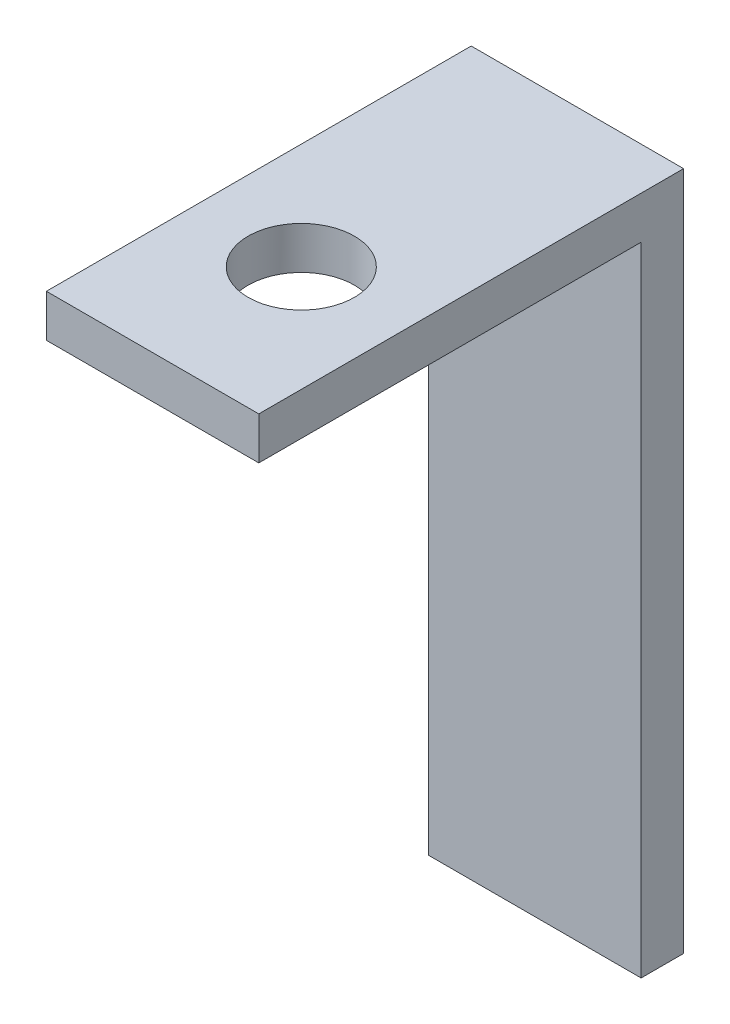
ISO-10303-21;
HEADER;
FILE_DESCRIPTION(('STEP AP214'),'2;1');
FILE_NAME('part.step','',(''),(''),'','','');
FILE_SCHEMA(('AUTOMOTIVE_DESIGN { 1 0 10303 214 1 1 1 1 }'));
ENDSEC;
DATA;
#1=APPLICATION_CONTEXT('core data for automotive mechanical design processes');
#2=APPLICATION_PROTOCOL_DEFINITION('international standard','automotive_design',2000,#1);
#3=PRODUCT_CONTEXT('',#1,'mechanical');
#4=PRODUCT('Part','Part','',(#3));
#5=PRODUCT_RELATED_PRODUCT_CATEGORY('part','',(#4));
#6=PRODUCT_DEFINITION_FORMATION('','',#4);
#7=PRODUCT_DEFINITION_CONTEXT('part definition',#1,'design');
#8=PRODUCT_DEFINITION('design','',#6,#7);
#9=PRODUCT_DEFINITION_SHAPE('','',#8);
#10=(LENGTH_UNIT() NAMED_UNIT(*) SI_UNIT(.MILLI.,.METRE.));
#11=(NAMED_UNIT(*) PLANE_ANGLE_UNIT() SI_UNIT($,.RADIAN.));
#12=(NAMED_UNIT(*) SI_UNIT($,.STERADIAN.) SOLID_ANGLE_UNIT());
#13=UNCERTAINTY_MEASURE_WITH_UNIT(LENGTH_MEASURE(1.E-05),#10,'distance_accuracy_value','');
#14=(GEOMETRIC_REPRESENTATION_CONTEXT(3) GLOBAL_UNCERTAINTY_ASSIGNED_CONTEXT((#13)) GLOBAL_UNIT_ASSIGNED_CONTEXT((#10,
#11,#12)) REPRESENTATION_CONTEXT('',''));
#15=CARTESIAN_POINT('',(0.,0.,0.));
#16=DIRECTION('',(0.,0.,1.));
#17=DIRECTION('',(1.,0.,0.));
#18=AXIS2_PLACEMENT_3D('',#15,#16,#17);
#19=CARTESIAN_POINT('',(5.,16.,2.));
#20=DIRECTION('',(-1.,0.,0.));
#21=DIRECTION('',(0.,-1.,0.));
#22=AXIS2_PLACEMENT_3D('',#19,#20,#21);
#23=PLANE('',#22);
#24=DIRECTION('',(0.,1.,0.));
#25=VECTOR('',#24,1.);
#26=CARTESIAN_POINT('',(5.,16.,0.));
#27=LINE('',#26,#25);
#28=CARTESIAN_POINT('',(5.,-16.,0.));
#29=VERTEX_POINT('',#28);
#30=CARTESIAN_POINT('',(5.,16.,0.));
#31=VERTEX_POINT('',#30);
#32=EDGE_CURVE('E92',#29,#31,#27,.T.);
#33=ORIENTED_EDGE('',*,*,#32,.T.);
#34=DIRECTION('',(0.,0.,-1.));
#35=VECTOR('',#34,1.);
#36=CARTESIAN_POINT('',(5.,16.,2.));
#37=LINE('',#36,#35);
#38=CARTESIAN_POINT('',(5.,16.,20.));
#39=VERTEX_POINT('',#38);
#40=EDGE_CURVE('E11',#39,#31,#37,.T.);
#41=ORIENTED_EDGE('',*,*,#40,.F.);
#42=DIRECTION('',(0.,1.,0.));
#43=VECTOR('',#42,1.);
#44=CARTESIAN_POINT('',(5.,16.,20.));
#45=LINE('',#44,#43);
#46=CARTESIAN_POINT('',(5.,14.,20.));
#47=VERTEX_POINT('',#46);
#48=EDGE_CURVE('E121',#47,#39,#45,.T.);
#49=ORIENTED_EDGE('',*,*,#48,.F.);
#50=DIRECTION('',(0.,0.,-1.));
#51=VECTOR('',#50,1.);
#52=CARTESIAN_POINT('',(5.,14.,20.));
#53=LINE('',#52,#51);
#54=CARTESIAN_POINT('',(5.,14.,2.));
#55=VERTEX_POINT('',#54);
#56=EDGE_CURVE('E101',#47,#55,#53,.T.);
#57=ORIENTED_EDGE('',*,*,#56,.T.);
#58=DIRECTION('',(0.,1.,0.));
#59=VECTOR('',#58,1.);
#60=CARTESIAN_POINT('',(5.,16.,2.));
#61=LINE('',#60,#59);
#62=CARTESIAN_POINT('',(5.,-16.,2.));
#63=VERTEX_POINT('',#62);
#64=EDGE_CURVE('E86',#63,#55,#61,.T.);
#65=ORIENTED_EDGE('',*,*,#64,.F.);
#66=DIRECTION('',(0.,0.,-1.));
#67=VECTOR('',#66,1.);
#68=CARTESIAN_POINT('',(5.,-16.,2.));
#69=LINE('',#68,#67);
#70=EDGE_CURVE('E79',#63,#29,#69,.T.);
#71=ORIENTED_EDGE('',*,*,#70,.T.);
#72=EDGE_LOOP('',(#33,#41,#49,#57,#65,#71));
#73=FACE_BOUND('',#72,.T.);
#74=ADVANCED_FACE('F35',(#73),#23,.F.);
#75=CARTESIAN_POINT('',(-5.,16.,2.));
#76=DIRECTION('',(0.,-1.,0.));
#77=DIRECTION('',(0.,0.,-1.));
#78=AXIS2_PLACEMENT_3D('',#75,#76,#77);
#79=PLANE('',#78);
#80=CARTESIAN_POINT('',(0.,16.,13.));
#81=DIRECTION('',(0.,1.,0.));
#82=DIRECTION('',(0.,0.,1.));
#83=AXIS2_PLACEMENT_3D('',#80,#81,#82);
#84=CIRCLE('',#83,2.5);
#85=CARTESIAN_POINT('',(0.,16.,15.5));
#86=VERTEX_POINT('',#85);
#87=EDGE_CURVE('E144',#86,#86,#84,.T.);
#88=ORIENTED_EDGE('',*,*,#87,.F.);
#89=EDGE_LOOP('',(#88));
#90=FACE_BOUND('',#89,.T.);
#91=DIRECTION('',(-1.,0.,0.));
#92=VECTOR('',#91,1.);
#93=CARTESIAN_POINT('',(-5.,16.,0.));
#94=LINE('',#93,#92);
#95=CARTESIAN_POINT('',(-5.,16.,0.));
#96=VERTEX_POINT('',#95);
#97=EDGE_CURVE('E96',#31,#96,#94,.T.);
#98=ORIENTED_EDGE('',*,*,#97,.T.);
#99=DIRECTION('',(0.,0.,-1.));
#100=VECTOR('',#99,1.);
#101=CARTESIAN_POINT('',(-5.,16.,2.));
#102=LINE('',#101,#100);
#103=CARTESIAN_POINT('',(-5.,16.,20.));
#104=VERTEX_POINT('',#103);
#105=EDGE_CURVE('E43',#104,#96,#102,.T.);
#106=ORIENTED_EDGE('',*,*,#105,.F.);
#107=DIRECTION('',(-1.,0.,0.));
#108=VECTOR('',#107,1.);
#109=CARTESIAN_POINT('',(-5.,16.,20.));
#110=LINE('',#109,#108);
#111=EDGE_CURVE('E134',#39,#104,#110,.T.);
#112=ORIENTED_EDGE('',*,*,#111,.F.);
#113=ORIENTED_EDGE('',*,*,#40,.T.);
#114=EDGE_LOOP('',(#98,#106,#112,#113));
#115=FACE_BOUND('',#114,.T.);
#116=ADVANCED_FACE('F150',(#90,#115),#79,.F.);
#117=CARTESIAN_POINT('',(-5.,16.,2.));
#118=DIRECTION('',(1.,0.,0.));
#119=DIRECTION('',(0.,1.,0.));
#120=AXIS2_PLACEMENT_3D('',#117,#118,#119);
#121=PLANE('',#120);
#122=DIRECTION('',(0.,-1.,0.));
#123=VECTOR('',#122,1.);
#124=CARTESIAN_POINT('',(-5.,16.,0.));
#125=LINE('',#124,#123);
#126=CARTESIAN_POINT('',(-5.,-16.,0.));
#127=VERTEX_POINT('',#126);
#128=EDGE_CURVE('E87',#96,#127,#125,.T.);
#129=ORIENTED_EDGE('',*,*,#128,.T.);
#130=DIRECTION('',(0.,0.,-1.));
#131=VECTOR('',#130,1.);
#132=CARTESIAN_POINT('',(-5.,-16.,2.));
#133=LINE('',#132,#131);
#134=CARTESIAN_POINT('',(-5.,-16.,2.));
#135=VERTEX_POINT('',#134);
#136=EDGE_CURVE('E82',#135,#127,#133,.T.);
#137=ORIENTED_EDGE('',*,*,#136,.F.);
#138=DIRECTION('',(0.,-1.,0.));
#139=VECTOR('',#138,1.);
#140=CARTESIAN_POINT('',(-5.,16.,2.));
#141=LINE('',#140,#139);
#142=CARTESIAN_POINT('',(-5.,14.,2.));
#143=VERTEX_POINT('',#142);
#144=EDGE_CURVE('E111',#143,#135,#141,.T.);
#145=ORIENTED_EDGE('',*,*,#144,.F.);
#146=DIRECTION('',(0.,0.,-1.));
#147=VECTOR('',#146,1.);
#148=CARTESIAN_POINT('',(-5.,14.,20.));
#149=LINE('',#148,#147);
#150=CARTESIAN_POINT('',(-5.,14.,20.));
#151=VERTEX_POINT('',#150);
#152=EDGE_CURVE('E97',#151,#143,#149,.T.);
#153=ORIENTED_EDGE('',*,*,#152,.F.);
#154=DIRECTION('',(0.,-1.,0.));
#155=VECTOR('',#154,1.);
#156=CARTESIAN_POINT('',(-5.,16.,20.));
#157=LINE('',#156,#155);
#158=EDGE_CURVE('E129',#104,#151,#157,.T.);
#159=ORIENTED_EDGE('',*,*,#158,.F.);
#160=ORIENTED_EDGE('',*,*,#105,.T.);
#161=EDGE_LOOP('',(#129,#137,#145,#153,#159,#160));
#162=FACE_BOUND('',#161,.T.);
#163=ADVANCED_FACE('F153',(#162),#121,.F.);
#164=CARTESIAN_POINT('',(-5.,-16.,2.));
#165=DIRECTION('',(0.,1.,0.));
#166=DIRECTION('',(0.,0.,1.));
#167=AXIS2_PLACEMENT_3D('',#164,#165,#166);
#168=PLANE('',#167);
#169=DIRECTION('',(1.,0.,0.));
#170=VECTOR('',#169,1.);
#171=CARTESIAN_POINT('',(-5.,-16.,0.));
#172=LINE('',#171,#170);
#173=EDGE_CURVE('E76',#127,#29,#172,.T.);
#174=ORIENTED_EDGE('',*,*,#173,.T.);
#175=ORIENTED_EDGE('',*,*,#70,.F.);
#176=DIRECTION('',(1.,0.,0.));
#177=VECTOR('',#176,1.);
#178=CARTESIAN_POINT('',(-5.,-16.,2.));
#179=LINE('',#178,#177);
#180=EDGE_CURVE('E57',#135,#63,#179,.T.);
#181=ORIENTED_EDGE('',*,*,#180,.F.);
#182=ORIENTED_EDGE('',*,*,#136,.T.);
#183=EDGE_LOOP('',(#174,#175,#181,#182));
#184=FACE_BOUND('',#183,.T.);
#185=ADVANCED_FACE('F78',(#184),#168,.F.);
#186=CARTESIAN_POINT('',(0.,0.,2.));
#187=DIRECTION('',(0.,0.,1.));
#188=DIRECTION('',(1.,0.,0.));
#189=AXIS2_PLACEMENT_3D('',#186,#187,#188);
#190=PLANE('',#189);
#191=DIRECTION('',(1.,0.,0.));
#192=VECTOR('',#191,1.);
#193=CARTESIAN_POINT('',(-5.,14.,2.));
#194=LINE('',#193,#192);
#195=EDGE_CURVE('E51',#143,#55,#194,.T.);
#196=ORIENTED_EDGE('',*,*,#195,.F.);
#197=ORIENTED_EDGE('',*,*,#144,.T.);
#198=ORIENTED_EDGE('',*,*,#180,.T.);
#199=ORIENTED_EDGE('',*,*,#64,.T.);
#200=EDGE_LOOP('',(#196,#197,#198,#199));
#201=FACE_BOUND('',#200,.T.);
#202=ADVANCED_FACE('F163',(#201),#190,.T.);
#203=CARTESIAN_POINT('',(0.,0.,0.));
#204=DIRECTION('',(0.,0.,1.));
#205=DIRECTION('',(1.,0.,0.));
#206=AXIS2_PLACEMENT_3D('',#203,#204,#205);
#207=PLANE('',#206);
#208=ORIENTED_EDGE('',*,*,#32,.F.);
#209=ORIENTED_EDGE('',*,*,#173,.F.);
#210=ORIENTED_EDGE('',*,*,#128,.F.);
#211=ORIENTED_EDGE('',*,*,#97,.F.);
#212=EDGE_LOOP('',(#208,#209,#210,#211));
#213=FACE_BOUND('',#212,.T.);
#214=ADVANCED_FACE('F95',(#213),#207,.F.);
#215=CARTESIAN_POINT('',(-5.,14.,20.));
#216=DIRECTION('',(0.,1.,0.));
#217=DIRECTION('',(-1.,0.,0.));
#218=AXIS2_PLACEMENT_3D('',#215,#216,#217);
#219=PLANE('',#218);
#220=CARTESIAN_POINT('',(0.,14.,13.));
#221=DIRECTION('',(0.,1.,0.));
#222=DIRECTION('',(-1.,0.,0.));
#223=AXIS2_PLACEMENT_3D('',#220,#221,#222);
#224=CIRCLE('',#223,2.5);
#225=CARTESIAN_POINT('',(-2.5,14.,13.));
#226=VERTEX_POINT('',#225);
#227=EDGE_CURVE('E122',#226,#226,#224,.F.);
#228=ORIENTED_EDGE('',*,*,#227,.F.);
#229=EDGE_LOOP('',(#228));
#230=FACE_BOUND('',#229,.T.);
#231=ORIENTED_EDGE('',*,*,#195,.T.);
#232=ORIENTED_EDGE('',*,*,#56,.F.);
#233=DIRECTION('',(1.,0.,0.));
#234=VECTOR('',#233,1.);
#235=CARTESIAN_POINT('',(-5.,14.,20.));
#236=LINE('',#235,#234);
#237=EDGE_CURVE('E118',#151,#47,#236,.T.);
#238=ORIENTED_EDGE('',*,*,#237,.F.);
#239=ORIENTED_EDGE('',*,*,#152,.T.);
#240=EDGE_LOOP('',(#231,#232,#238,#239));
#241=FACE_BOUND('',#240,.T.);
#242=ADVANCED_FACE('F165',(#230,#241),#219,.F.);
#243=CARTESIAN_POINT('',(0.,0.,20.));
#244=DIRECTION('',(0.,0.,1.));
#245=DIRECTION('',(1.,0.,0.));
#246=AXIS2_PLACEMENT_3D('',#243,#244,#245);
#247=PLANE('',#246);
#248=ORIENTED_EDGE('',*,*,#48,.T.);
#249=ORIENTED_EDGE('',*,*,#111,.T.);
#250=ORIENTED_EDGE('',*,*,#158,.T.);
#251=ORIENTED_EDGE('',*,*,#237,.T.);
#252=EDGE_LOOP('',(#248,#249,#250,#251));
#253=FACE_BOUND('',#252,.T.);
#254=ADVANCED_FACE('F166',(#253),#247,.T.);
#255=CARTESIAN_POINT('',(0.,6.92893218813452,13.));
#256=DIRECTION('',(0.,1.,0.));
#257=DIRECTION('',(0.,0.,1.));
#258=AXIS2_PLACEMENT_3D('',#255,#256,#257);
#259=CYLINDRICAL_SURFACE('',#258,2.5);
#260=ORIENTED_EDGE('',*,*,#227,.T.);
#261=EDGE_LOOP('',(#260));
#262=FACE_BOUND('',#261,.T.);
#263=ORIENTED_EDGE('',*,*,#87,.T.);
#264=EDGE_LOOP('',(#263));
#265=FACE_BOUND('',#264,.T.);
#266=ADVANCED_FACE('F148',(#262,#265),#259,.F.);
#267=CLOSED_SHELL('',(#74,#116,#163,#185,#202,#214,#242,#254,#266));
#268=MANIFOLD_SOLID_BREP('B2',#267);
#269=ADVANCED_BREP_SHAPE_REPRESENTATION('',(#18,#268),#14);
#270=SHAPE_DEFINITION_REPRESENTATION(#9,#269);
ENDSEC;
END-ISO-10303-21;
